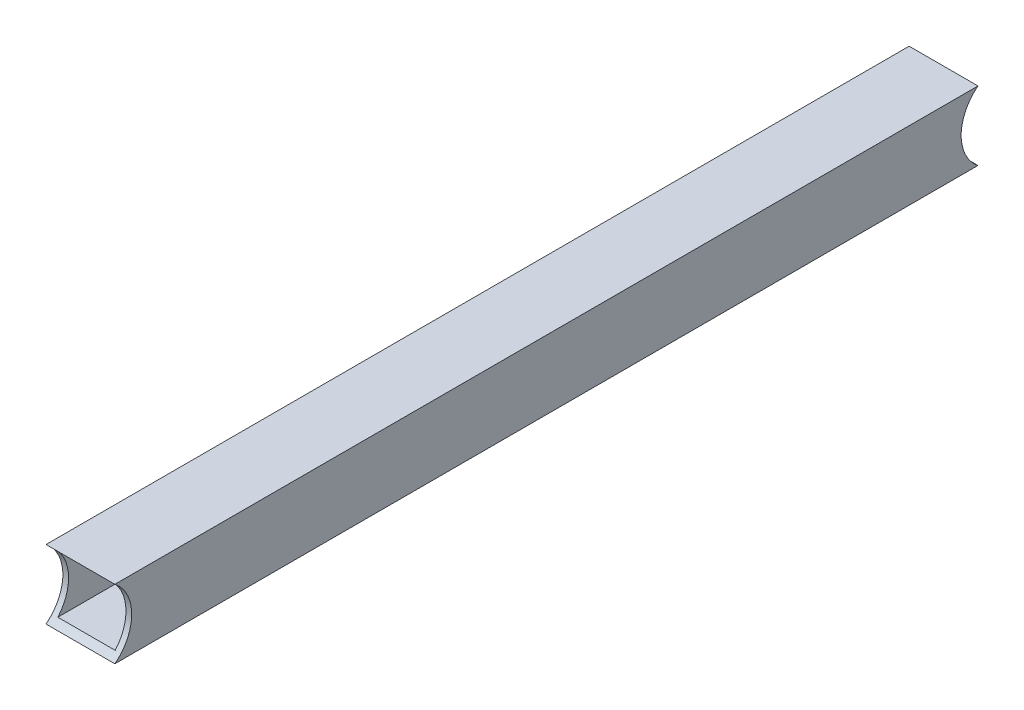
ISO-10303-21;
HEADER;
FILE_DESCRIPTION(('STEP AP214'),'2;1');
FILE_NAME('part.step','',(''),(''),'','','');
FILE_SCHEMA(('AUTOMOTIVE_DESIGN { 1 0 10303 214 1 1 1 1 }'));
ENDSEC;
DATA;
#1=APPLICATION_CONTEXT('core data for automotive mechanical design processes');
#2=APPLICATION_PROTOCOL_DEFINITION('international standard','automotive_design',2000,#1);
#3=PRODUCT_CONTEXT('',#1,'mechanical');
#4=PRODUCT('Part','Part','',(#3));
#5=PRODUCT_RELATED_PRODUCT_CATEGORY('part','',(#4));
#6=PRODUCT_DEFINITION_FORMATION('','',#4);
#7=PRODUCT_DEFINITION_CONTEXT('part definition',#1,'design');
#8=PRODUCT_DEFINITION('design','',#6,#7);
#9=PRODUCT_DEFINITION_SHAPE('','',#8);
#10=(LENGTH_UNIT() NAMED_UNIT(*) SI_UNIT(.MILLI.,.METRE.));
#11=(NAMED_UNIT(*) PLANE_ANGLE_UNIT() SI_UNIT($,.RADIAN.));
#12=(NAMED_UNIT(*) SI_UNIT($,.STERADIAN.) SOLID_ANGLE_UNIT());
#13=UNCERTAINTY_MEASURE_WITH_UNIT(LENGTH_MEASURE(1.E-05),#10,'distance_accuracy_value','');
#14=(GEOMETRIC_REPRESENTATION_CONTEXT(3) GLOBAL_UNCERTAINTY_ASSIGNED_CONTEXT((#13)) GLOBAL_UNIT_ASSIGNED_CONTEXT((#10,
#11,#12)) REPRESENTATION_CONTEXT('',''));
#15=CARTESIAN_POINT('',(0.,0.,0.));
#16=DIRECTION('',(0.,0.,1.));
#17=DIRECTION('',(1.,0.,0.));
#18=AXIS2_PLACEMENT_3D('',#15,#16,#17);
#19=CARTESIAN_POINT('',(38.1,19.05,-507.13386));
#20=DIRECTION('',(-1.,0.,0.));
#21=DIRECTION('',(0.,0.,1.));
#22=AXIS2_PLACEMENT_3D('',#19,#20,#21);
#23=CYLINDRICAL_SURFACE('',#22,24.1299999999999);
#24=DIRECTION('',(-1.,0.,0.));
#25=VECTOR('',#24,1.);
#26=CARTESIAN_POINT('',(38.1,34.925,-488.961318213007));
#27=LINE('',#26,#25);
#28=CARTESIAN_POINT('',(3.175,34.925,-488.961318213007));
#29=VERTEX_POINT('',#28);
#30=CARTESIAN_POINT('',(34.925,34.925,-488.961318213007));
#31=VERTEX_POINT('',#30);
#32=EDGE_CURVE('E106',#29,#31,#27,.F.);
#33=ORIENTED_EDGE('',*,*,#32,.F.);
#34=CARTESIAN_POINT('',(3.175,19.05,-507.13386));
#35=DIRECTION('',(-1.,0.,0.));
#36=DIRECTION('',(0.,0.,1.));
#37=AXIS2_PLACEMENT_3D('',#34,#35,#36);
#38=CIRCLE('',#37,24.1299999999999);
#39=CARTESIAN_POINT('',(3.175,3.17500000000001,-488.961318213007));
#40=VERTEX_POINT('',#39);
#41=EDGE_CURVE('E95',#40,#29,#38,.T.);
#42=ORIENTED_EDGE('',*,*,#41,.F.);
#43=DIRECTION('',(-1.,0.,0.));
#44=VECTOR('',#43,1.);
#45=CARTESIAN_POINT('',(38.1,3.17500000000001,-488.961318213007));
#46=LINE('',#45,#44);
#47=CARTESIAN_POINT('',(34.925,3.175,-488.961318213007));
#48=VERTEX_POINT('',#47);
#49=EDGE_CURVE('E100',#48,#40,#46,.T.);
#50=ORIENTED_EDGE('',*,*,#49,.F.);
#51=CARTESIAN_POINT('',(34.925,19.05,-507.13386));
#52=DIRECTION('',(1.,0.,0.));
#53=DIRECTION('',(0.,0.,-1.));
#54=AXIS2_PLACEMENT_3D('',#51,#52,#53);
#55=CIRCLE('',#54,24.1299999999999);
#56=EDGE_CURVE('E113',#31,#48,#55,.T.);
#57=ORIENTED_EDGE('',*,*,#56,.F.);
#58=EDGE_LOOP('',(#33,#42,#50,#57));
#59=FACE_BOUND('',#58,.T.);
#60=CARTESIAN_POINT('',(0.,19.05,-507.13386));
#61=DIRECTION('',(1.,0.,0.));
#62=DIRECTION('',(0.,0.,-1.));
#63=AXIS2_PLACEMENT_3D('',#60,#61,#62);
#64=CIRCLE('',#63,24.1299999999999);
#65=CARTESIAN_POINT('',(0.,38.1,-492.323242187093));
#66=VERTEX_POINT('',#65);
#67=CARTESIAN_POINT('',(0.,0.,-492.323242187093));
#68=VERTEX_POINT('',#67);
#69=EDGE_CURVE('E114',#66,#68,#64,.T.);
#70=ORIENTED_EDGE('',*,*,#69,.F.);
#71=DIRECTION('',(-1.,0.,0.));
#72=VECTOR('',#71,1.);
#73=CARTESIAN_POINT('',(38.1,38.1,-492.323242187093));
#74=LINE('',#73,#72);
#75=CARTESIAN_POINT('',(38.1,38.1,-492.323242187093));
#76=VERTEX_POINT('',#75);
#77=EDGE_CURVE('E147',#76,#66,#74,.T.);
#78=ORIENTED_EDGE('',*,*,#77,.F.);
#79=CARTESIAN_POINT('',(38.1,19.05,-507.13386));
#80=DIRECTION('',(1.,0.,0.));
#81=DIRECTION('',(0.,0.,-1.));
#82=AXIS2_PLACEMENT_3D('',#79,#80,#81);
#83=CIRCLE('',#82,24.1299999999999);
#84=CARTESIAN_POINT('',(38.1,0.,-492.323242187093));
#85=VERTEX_POINT('',#84);
#86=EDGE_CURVE('E122',#76,#85,#83,.T.);
#87=ORIENTED_EDGE('',*,*,#86,.T.);
#88=DIRECTION('',(-1.,0.,0.));
#89=VECTOR('',#88,1.);
#90=CARTESIAN_POINT('',(38.1,0.,-492.323242187093));
#91=LINE('',#90,#89);
#92=EDGE_CURVE('E133',#85,#68,#91,.T.);
#93=ORIENTED_EDGE('',*,*,#92,.T.);
#94=EDGE_LOOP('',(#70,#78,#87,#93));
#95=FACE_BOUND('',#94,.T.);
#96=ADVANCED_FACE('F35',(#59,#95),#23,.F.);
#97=CARTESIAN_POINT('',(38.1,38.1,0.));
#98=DIRECTION('',(0.,1.,0.));
#99=DIRECTION('',(0.,0.,1.));
#100=AXIS2_PLACEMENT_3D('',#97,#98,#99);
#101=PLANE('',#100);
#102=DIRECTION('',(0.,0.,-1.));
#103=VECTOR('',#102,1.);
#104=CARTESIAN_POINT('',(0.,38.1,0.));
#105=LINE('',#104,#103);
#106=CARTESIAN_POINT('',(0.,38.1,-14.8106178129071));
#107=VERTEX_POINT('',#106);
#108=EDGE_CURVE('E117',#107,#66,#105,.T.);
#109=ORIENTED_EDGE('',*,*,#108,.F.);
#110=DIRECTION('',(-1.,0.,0.));
#111=VECTOR('',#110,1.);
#112=CARTESIAN_POINT('',(38.1,38.1,-14.8106178129071));
#113=LINE('',#112,#111);
#114=CARTESIAN_POINT('',(38.1,38.1,-14.8106178129071));
#115=VERTEX_POINT('',#114);
#116=EDGE_CURVE('E145',#115,#107,#113,.T.);
#117=ORIENTED_EDGE('',*,*,#116,.F.);
#118=DIRECTION('',(0.,0.,-1.));
#119=VECTOR('',#118,1.);
#120=CARTESIAN_POINT('',(38.1,38.1,0.));
#121=LINE('',#120,#119);
#122=EDGE_CURVE('E125',#115,#76,#121,.T.);
#123=ORIENTED_EDGE('',*,*,#122,.T.);
#124=ORIENTED_EDGE('',*,*,#77,.T.);
#125=EDGE_LOOP('',(#109,#117,#123,#124));
#126=FACE_BOUND('',#125,.T.);
#127=ADVANCED_FACE('F176',(#126),#101,.T.);
#128=CARTESIAN_POINT('',(38.1,19.05,0.));
#129=DIRECTION('',(-1.,0.,0.));
#130=DIRECTION('',(0.,0.,1.));
#131=AXIS2_PLACEMENT_3D('',#128,#129,#130);
#132=CYLINDRICAL_SURFACE('',#131,24.13);
#133=DIRECTION('',(-1.,0.,0.));
#134=VECTOR('',#133,1.);
#135=CARTESIAN_POINT('',(38.1,34.925,-18.1725417869928));
#136=LINE('',#135,#134);
#137=CARTESIAN_POINT('',(34.925,34.925,-18.1725417869928));
#138=VERTEX_POINT('',#137);
#139=CARTESIAN_POINT('',(3.175,34.925,-18.1725417869928));
#140=VERTEX_POINT('',#139);
#141=EDGE_CURVE('E11',#138,#140,#136,.T.);
#142=ORIENTED_EDGE('',*,*,#141,.F.);
#143=CARTESIAN_POINT('',(34.925,19.05,0.));
#144=DIRECTION('',(1.,0.,0.));
#145=DIRECTION('',(0.,0.,-1.));
#146=AXIS2_PLACEMENT_3D('',#143,#144,#145);
#147=CIRCLE('',#146,24.13);
#148=CARTESIAN_POINT('',(34.925,3.175,-18.172541786993));
#149=VERTEX_POINT('',#148);
#150=EDGE_CURVE('E42',#149,#138,#147,.T.);
#151=ORIENTED_EDGE('',*,*,#150,.F.);
#152=DIRECTION('',(-1.,0.,0.));
#153=VECTOR('',#152,1.);
#154=CARTESIAN_POINT('',(38.1,3.17500000000001,-18.1725417869928));
#155=LINE('',#154,#153);
#156=CARTESIAN_POINT('',(3.175,3.17500000000001,-18.1725417869928));
#157=VERTEX_POINT('',#156);
#158=EDGE_CURVE('E151',#157,#149,#155,.F.);
#159=ORIENTED_EDGE('',*,*,#158,.F.);
#160=CARTESIAN_POINT('',(3.175,19.05,0.));
#161=DIRECTION('',(-1.,0.,0.));
#162=DIRECTION('',(0.,0.,1.));
#163=AXIS2_PLACEMENT_3D('',#160,#161,#162);
#164=CIRCLE('',#163,24.13);
#165=EDGE_CURVE('E149',#140,#157,#164,.T.);
#166=ORIENTED_EDGE('',*,*,#165,.F.);
#167=EDGE_LOOP('',(#142,#151,#159,#166));
#168=FACE_BOUND('',#167,.T.);
#169=CARTESIAN_POINT('',(0.,19.05,0.));
#170=DIRECTION('',(1.,0.,0.));
#171=DIRECTION('',(0.,0.,-1.));
#172=AXIS2_PLACEMENT_3D('',#169,#170,#171);
#173=CIRCLE('',#172,24.13);
#174=CARTESIAN_POINT('',(0.,0.,-14.8106178129071));
#175=VERTEX_POINT('',#174);
#176=EDGE_CURVE('E137',#175,#107,#173,.T.);
#177=ORIENTED_EDGE('',*,*,#176,.F.);
#178=DIRECTION('',(-1.,0.,0.));
#179=VECTOR('',#178,1.);
#180=CARTESIAN_POINT('',(38.1,0.,-14.8106178129071));
#181=LINE('',#180,#179);
#182=CARTESIAN_POINT('',(38.1,0.,-14.8106178129071));
#183=VERTEX_POINT('',#182);
#184=EDGE_CURVE('E143',#183,#175,#181,.T.);
#185=ORIENTED_EDGE('',*,*,#184,.F.);
#186=CARTESIAN_POINT('',(38.1,19.05,0.));
#187=DIRECTION('',(1.,0.,0.));
#188=DIRECTION('',(0.,0.,-1.));
#189=AXIS2_PLACEMENT_3D('',#186,#187,#188);
#190=CIRCLE('',#189,24.13);
#191=EDGE_CURVE('E129',#183,#115,#190,.T.);
#192=ORIENTED_EDGE('',*,*,#191,.T.);
#193=ORIENTED_EDGE('',*,*,#116,.T.);
#194=EDGE_LOOP('',(#177,#185,#192,#193));
#195=FACE_BOUND('',#194,.T.);
#196=ADVANCED_FACE('F161',(#168,#195),#132,.F.);
#197=CARTESIAN_POINT('',(38.1,0.,0.));
#198=DIRECTION('',(0.,1.,0.));
#199=DIRECTION('',(0.,0.,1.));
#200=AXIS2_PLACEMENT_3D('',#197,#198,#199);
#201=PLANE('',#200);
#202=DIRECTION('',(0.,0.,-1.));
#203=VECTOR('',#202,1.);
#204=CARTESIAN_POINT('',(0.,0.,0.));
#205=LINE('',#204,#203);
#206=EDGE_CURVE('E126',#175,#68,#205,.T.);
#207=ORIENTED_EDGE('',*,*,#206,.T.);
#208=ORIENTED_EDGE('',*,*,#92,.F.);
#209=DIRECTION('',(0.,0.,-1.));
#210=VECTOR('',#209,1.);
#211=CARTESIAN_POINT('',(38.1,0.,0.));
#212=LINE('',#211,#210);
#213=EDGE_CURVE('E132',#183,#85,#212,.T.);
#214=ORIENTED_EDGE('',*,*,#213,.F.);
#215=ORIENTED_EDGE('',*,*,#184,.T.);
#216=EDGE_LOOP('',(#207,#208,#214,#215));
#217=FACE_BOUND('',#216,.T.);
#218=ADVANCED_FACE('F184',(#217),#201,.F.);
#219=CARTESIAN_POINT('',(38.1,0.,0.));
#220=DIRECTION('',(1.,0.,0.));
#221=DIRECTION('',(0.,0.,-1.));
#222=AXIS2_PLACEMENT_3D('',#219,#220,#221);
#223=PLANE('',#222);
#224=ORIENTED_EDGE('',*,*,#86,.F.);
#225=ORIENTED_EDGE('',*,*,#122,.F.);
#226=ORIENTED_EDGE('',*,*,#191,.F.);
#227=ORIENTED_EDGE('',*,*,#213,.T.);
#228=EDGE_LOOP('',(#224,#225,#226,#227));
#229=FACE_BOUND('',#228,.T.);
#230=ADVANCED_FACE('F190',(#229),#223,.T.);
#231=CARTESIAN_POINT('',(0.,0.,0.));
#232=DIRECTION('',(1.,0.,0.));
#233=DIRECTION('',(0.,0.,-1.));
#234=AXIS2_PLACEMENT_3D('',#231,#232,#233);
#235=PLANE('',#234);
#236=ORIENTED_EDGE('',*,*,#69,.T.);
#237=ORIENTED_EDGE('',*,*,#206,.F.);
#238=ORIENTED_EDGE('',*,*,#176,.T.);
#239=ORIENTED_EDGE('',*,*,#108,.T.);
#240=EDGE_LOOP('',(#236,#237,#238,#239));
#241=FACE_BOUND('',#240,.T.);
#242=ADVANCED_FACE('F192',(#241),#235,.F.);
#243=CARTESIAN_POINT('',(34.925,34.925,-492.323242187093));
#244=DIRECTION('',(0.,1.,0.));
#245=DIRECTION('',(0.,0.,1.));
#246=AXIS2_PLACEMENT_3D('',#243,#244,#245);
#247=PLANE('',#246);
#248=ORIENTED_EDGE('',*,*,#32,.T.);
#249=DIRECTION('',(0.,0.,1.));
#250=VECTOR('',#249,1.);
#251=CARTESIAN_POINT('',(34.925,34.925,-492.323242187093));
#252=LINE('',#251,#250);
#253=EDGE_CURVE('E101',#31,#138,#252,.T.);
#254=ORIENTED_EDGE('',*,*,#253,.T.);
#255=ORIENTED_EDGE('',*,*,#141,.T.);
#256=DIRECTION('',(0.,0.,1.));
#257=VECTOR('',#256,1.);
#258=CARTESIAN_POINT('',(3.175,34.925,-492.323242187093));
#259=LINE('',#258,#257);
#260=EDGE_CURVE('E54',#29,#140,#259,.T.);
#261=ORIENTED_EDGE('',*,*,#260,.F.);
#262=EDGE_LOOP('',(#248,#254,#255,#261));
#263=FACE_BOUND('',#262,.T.);
#264=ADVANCED_FACE('F104',(#263),#247,.F.);
#265=CARTESIAN_POINT('',(34.925,3.175,-492.323242187093));
#266=DIRECTION('',(1.,0.,0.));
#267=DIRECTION('',(0.,0.,-1.));
#268=AXIS2_PLACEMENT_3D('',#265,#266,#267);
#269=PLANE('',#268);
#270=ORIENTED_EDGE('',*,*,#56,.T.);
#271=DIRECTION('',(0.,0.,1.));
#272=VECTOR('',#271,1.);
#273=CARTESIAN_POINT('',(34.925,3.175,-492.323242187093));
#274=LINE('',#273,#272);
#275=EDGE_CURVE('E157',#48,#149,#274,.T.);
#276=ORIENTED_EDGE('',*,*,#275,.T.);
#277=ORIENTED_EDGE('',*,*,#150,.T.);
#278=ORIENTED_EDGE('',*,*,#253,.F.);
#279=EDGE_LOOP('',(#270,#276,#277,#278));
#280=FACE_BOUND('',#279,.T.);
#281=ADVANCED_FACE('F155',(#280),#269,.F.);
#282=CARTESIAN_POINT('',(3.175,3.175,-492.323242187093));
#283=DIRECTION('',(0.,-1.,0.));
#284=DIRECTION('',(0.,0.,-1.));
#285=AXIS2_PLACEMENT_3D('',#282,#283,#284);
#286=PLANE('',#285);
#287=ORIENTED_EDGE('',*,*,#49,.T.);
#288=DIRECTION('',(0.,0.,1.));
#289=VECTOR('',#288,1.);
#290=CARTESIAN_POINT('',(3.175,3.175,-492.323242187093));
#291=LINE('',#290,#289);
#292=EDGE_CURVE('E49',#40,#157,#291,.T.);
#293=ORIENTED_EDGE('',*,*,#292,.T.);
#294=ORIENTED_EDGE('',*,*,#158,.T.);
#295=ORIENTED_EDGE('',*,*,#275,.F.);
#296=EDGE_LOOP('',(#287,#293,#294,#295));
#297=FACE_BOUND('',#296,.T.);
#298=ADVANCED_FACE('F164',(#297),#286,.F.);
#299=CARTESIAN_POINT('',(3.175,34.925,-492.323242187093));
#300=DIRECTION('',(-1.,0.,0.));
#301=DIRECTION('',(0.,0.,1.));
#302=AXIS2_PLACEMENT_3D('',#299,#300,#301);
#303=PLANE('',#302);
#304=ORIENTED_EDGE('',*,*,#41,.T.);
#305=ORIENTED_EDGE('',*,*,#260,.T.);
#306=ORIENTED_EDGE('',*,*,#165,.T.);
#307=ORIENTED_EDGE('',*,*,#292,.F.);
#308=EDGE_LOOP('',(#304,#305,#306,#307));
#309=FACE_BOUND('',#308,.T.);
#310=ADVANCED_FACE('F96',(#309),#303,.F.);
#311=CLOSED_SHELL('',(#96,#127,#196,#218,#230,#242,#264,#281,#298,#310));
#312=MANIFOLD_SOLID_BREP('B2',#311);
#313=ADVANCED_BREP_SHAPE_REPRESENTATION('',(#18,#312),#14);
#314=SHAPE_DEFINITION_REPRESENTATION(#9,#313);
ENDSEC;
END-ISO-10303-21;
